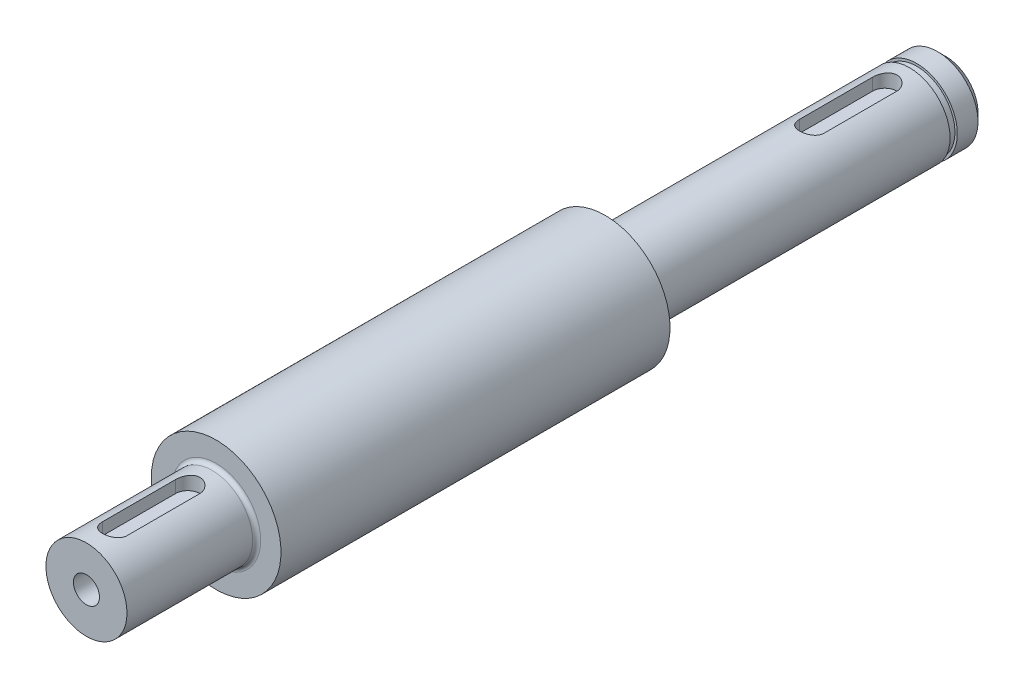
ISO-10303-21;
HEADER;
FILE_DESCRIPTION(('STEP AP214'),'2;1');
FILE_NAME('part.step','',(''),(''),'','','');
FILE_SCHEMA(('AUTOMOTIVE_DESIGN { 1 0 10303 214 1 1 1 1 }'));
ENDSEC;
DATA;
#1=APPLICATION_CONTEXT('core data for automotive mechanical design processes');
#2=APPLICATION_PROTOCOL_DEFINITION('international standard','automotive_design',2000,#1);
#3=PRODUCT_CONTEXT('',#1,'mechanical');
#4=PRODUCT('Part','Part','',(#3));
#5=PRODUCT_RELATED_PRODUCT_CATEGORY('part','',(#4));
#6=PRODUCT_DEFINITION_FORMATION('','',#4);
#7=PRODUCT_DEFINITION_CONTEXT('part definition',#1,'design');
#8=PRODUCT_DEFINITION('design','',#6,#7);
#9=PRODUCT_DEFINITION_SHAPE('','',#8);
#10=(LENGTH_UNIT() NAMED_UNIT(*) SI_UNIT(.MILLI.,.METRE.));
#11=(NAMED_UNIT(*) PLANE_ANGLE_UNIT() SI_UNIT($,.RADIAN.));
#12=(NAMED_UNIT(*) SI_UNIT($,.STERADIAN.) SOLID_ANGLE_UNIT());
#13=UNCERTAINTY_MEASURE_WITH_UNIT(LENGTH_MEASURE(1.E-05),#10,'distance_accuracy_value','');
#14=(GEOMETRIC_REPRESENTATION_CONTEXT(3) GLOBAL_UNCERTAINTY_ASSIGNED_CONTEXT((#13)) GLOBAL_UNIT_ASSIGNED_CONTEXT((#10,
#11,#12)) REPRESENTATION_CONTEXT('',''));
#15=CARTESIAN_POINT('',(0.,0.,0.));
#16=DIRECTION('',(0.,0.,1.));
#17=DIRECTION('',(1.,0.,0.));
#18=AXIS2_PLACEMENT_3D('',#15,#16,#17);
#19=CARTESIAN_POINT('',(0.,0.,-104.775));
#20=DIRECTION('',(0.,0.,1.));
#21=DIRECTION('',(1.,0.,0.));
#22=AXIS2_PLACEMENT_3D('',#19,#20,#21);
#23=CYLINDRICAL_SURFACE('',#22,7.9375);
#24=CARTESIAN_POINT('',(0.,0.,-97.7138));
#25=DIRECTION('',(0.,0.,-1.));
#26=DIRECTION('',(-1.,0.,0.));
#27=AXIS2_PLACEMENT_3D('',#24,#25,#26);
#28=CIRCLE('',#27,7.9375);
#29=CARTESIAN_POINT('',(-7.9375,0.,-97.7138));
#30=VERTEX_POINT('',#29);
#31=EDGE_CURVE('E328',#30,#30,#28,.T.);
#32=ORIENTED_EDGE('',*,*,#31,.F.);
#33=EDGE_LOOP('',(#32));
#34=FACE_BOUND('',#33,.T.);
#35=CARTESIAN_POINT('',(0.,0.,-38.89375));
#36=DIRECTION('',(0.,0.,1.));
#37=DIRECTION('',(1.,0.,0.));
#38=AXIS2_PLACEMENT_3D('',#35,#36,#37);
#39=CIRCLE('',#38,7.9375);
#40=CARTESIAN_POINT('',(7.9375,0.,-38.89375));
#41=VERTEX_POINT('',#40);
#42=EDGE_CURVE('E338',#41,#41,#39,.F.);
#43=ORIENTED_EDGE('',*,*,#42,.T.);
#44=EDGE_LOOP('',(#43));
#45=FACE_BOUND('',#44,.T.);
#46=CARTESIAN_POINT('',(2.38125,7.57189241124701,-78.58125));
#47=CARTESIAN_POINT('',(2.38125815852546,7.57188330559514,-78.515896180347));
#48=CARTESIAN_POINT('',(2.37855968505799,7.572738315761,-78.4505475887936));
#49=CARTESIAN_POINT('',(2.36781294676356,7.57610889609126,-78.3203491749924));
#50=CARTESIAN_POINT('',(2.3597658847055,7.57862409291874,-78.2554992439238));
#51=CARTESIAN_POINT('',(2.33841242871129,7.58523905503609,-78.1269194731844));
#52=CARTESIAN_POINT('',(2.32511938897703,7.58933479629779,-78.0631872152909));
#53=CARTESIAN_POINT('',(2.29340452092875,7.59897853654373,-77.9371410487185));
#54=CARTESIAN_POINT('',(2.27498255848908,7.60452657350651,-77.8748271771778));
#55=CARTESIAN_POINT('',(2.21224938904031,7.62310862387971,-77.6907026732828));
#56=CARTESIAN_POINT('',(2.16044345455984,7.63808962465373,-77.5715456766763));
#57=CARTESIAN_POINT('',(2.0384694080295,7.67153988586956,-77.3436143275917));
#58=CARTESIAN_POINT('',(1.96829275127301,7.69001076843196,-77.2348448388325));
#59=CARTESIAN_POINT('',(1.80919341959838,7.72901085096579,-77.0273073783164));
#60=CARTESIAN_POINT('',(1.719793635801,7.74958369966712,-76.9289126312142));
#61=CARTESIAN_POINT('',(1.52580765569405,7.79009767602093,-76.7482640682218));
#62=CARTESIAN_POINT('',(1.42121889879479,7.81003869646657,-76.6660129793728));
#63=CARTESIAN_POINT('',(1.19714960488396,7.84754016893874,-76.5183518008312));
#64=CARTESIAN_POINT('',(1.07740582874555,7.86504286102834,-76.4533251697976));
#65=CARTESIAN_POINT('',(0.828073603948397,7.89518471194964,-76.3444807530727));
#66=CARTESIAN_POINT('',(0.698487703771086,7.9078251246947,-76.3006574985767));
#67=CARTESIAN_POINT('',(0.437077965076354,7.92650878316165,-76.2367033557659));
#68=CARTESIAN_POINT('',(0.305424088331612,7.93273034455641,-76.2159307978329));
#69=CARTESIAN_POINT('',(0.0403599186203377,7.93850333232182,-76.1966387107279));
#70=CARTESIAN_POINT('',(-0.0930500370432356,7.93805602147906,-76.1981149686242));
#71=CARTESIAN_POINT('',(-0.353332414422008,7.93066744068434,-76.2228487451738));
#72=CARTESIAN_POINT('',(-0.480277718293151,7.92393347119356,-76.245410985829));
#73=CARTESIAN_POINT('',(-0.728487957843933,7.90498028000196,-76.3105402202653));
#74=CARTESIAN_POINT('',(-0.849752595567598,7.89276077093468,-76.3531082620794));
#75=CARTESIAN_POINT('',(-1.08481465769292,7.86392278694852,-76.4575119020478));
#76=CARTESIAN_POINT('',(-1.19850853458542,7.84725468411776,-76.5195663604661));
#77=CARTESIAN_POINT('',(-1.41409027820904,7.8112877913477,-76.6610077616523));
#78=CARTESIAN_POINT('',(-1.5159754916908,7.79198841230746,-76.7403985881592));
#79=CARTESIAN_POINT('',(-1.70918902734,7.75194781794582,-76.9178547810966));
#80=CARTESIAN_POINT('',(-1.79996070471305,7.73117969651158,-77.016520883724));
#81=CARTESIAN_POINT('',(-1.96384496569396,7.69118691494528,-77.2279021596881));
#82=CARTESIAN_POINT('',(-2.0369523969578,7.67196270623387,-77.3406214175793));
#83=CARTESIAN_POINT('',(-2.1640229649485,7.63710100713097,-77.5783959739143));
#84=CARTESIAN_POINT('',(-2.21778522566545,7.62150171540442,-77.7035643976048));
#85=CARTESIAN_POINT('',(-2.30323844032464,7.59611866049457,-77.9616876500708));
#86=CARTESIAN_POINT('',(-2.33496315483631,7.58632600517951,-78.094630228884));
#87=CARTESIAN_POINT('',(-2.3638066069925,7.57736026315947,-78.287554386399));
#88=CARTESIAN_POINT('',(-2.3703470974505,7.57531435586986,-78.3461265405101));
#89=CARTESIAN_POINT('',(-2.3790648953858,7.57258024171204,-78.4635392230705));
#90=CARTESIAN_POINT('',(-2.38124861837126,7.57189003854047,-78.5223792288414));
#91=CARTESIAN_POINT('',(-2.38124999999999,7.57189241124701,-78.58125));
#92=B_SPLINE_CURVE_WITH_KNOTS('',3,(#46,#47,#48,#49,#50,#51,#52,#53,#54,#55,#56,#57,#58,#59,#60,
#61,#62,#63,#64,#65,#66,#67,#68,#69,#70,#71,#72,#73,#74,#75,#76,#77,#78,#79,#80,#81,#82,#83,#84,
#85,#86,#87,#88,#89,#90,#91),.UNSPECIFIED.,.F.,.F.,(4,2,2,2,2,2,2,2,2,2,2,2,2,2,2,2,2,2,2,2,2,2,
4),(0.,0.195991275561324,0.391938492304214,0.587390088888293,0.782846797176359,1.17326844500357,
1.56387201187681,1.96560376359321,2.36740331889733,2.77751230929681,3.18751546734639,
3.58579420686406,3.98399753113254,4.36951721861804,4.75505710436409,5.14509213034555,
5.53521462280465,5.94033955159903,6.34558250580854,6.75491961154767,7.16362823927547,
7.3403957500019,7.51690277106334),.UNSPECIFIED.);
#93=CARTESIAN_POINT('',(2.38124999999999,7.57189241124701,-78.58125));
#94=VERTEX_POINT('',#93);
#95=CARTESIAN_POINT('',(-2.38124999999999,7.57189241124701,-78.58125));
#96=VERTEX_POINT('',#95);
#97=EDGE_CURVE('E260',#94,#96,#92,.T.);
#98=ORIENTED_EDGE('',*,*,#97,.T.);
#99=DIRECTION('',(0.,0.,1.));
#100=VECTOR('',#99,1.);
#101=CARTESIAN_POINT('',(-2.38125,7.57189241124701,-104.775));
#102=LINE('',#101,#100);
#103=CARTESIAN_POINT('',(-2.38125,7.57189241124701,-92.86875));
#104=VERTEX_POINT('',#103);
#105=EDGE_CURVE('E460',#96,#104,#102,.F.);
#106=ORIENTED_EDGE('',*,*,#105,.T.);
#107=CARTESIAN_POINT('',(-2.38125,7.57189241124701,-92.86875));
#108=CARTESIAN_POINT('',(-2.38125815852546,7.57188330559514,-92.934103819653));
#109=CARTESIAN_POINT('',(-2.37855968505799,7.572738315761,-92.9994524112064));
#110=CARTESIAN_POINT('',(-2.36781294676356,7.57610889609126,-93.1296508250076));
#111=CARTESIAN_POINT('',(-2.3597658847055,7.57862409291874,-93.1945007560762));
#112=CARTESIAN_POINT('',(-2.33841242871129,7.58523905503609,-93.3230805268156));
#113=CARTESIAN_POINT('',(-2.32511938897704,7.58933479629778,-93.3868127847092));
#114=CARTESIAN_POINT('',(-2.29340452092876,7.59897853654373,-93.5128589512815));
#115=CARTESIAN_POINT('',(-2.27498255848908,7.60452657350651,-93.5751728228222));
#116=CARTESIAN_POINT('',(-2.21224938904031,7.62310862387971,-93.7592973267172));
#117=CARTESIAN_POINT('',(-2.16044345455984,7.63808962465373,-93.8784543233237));
#118=CARTESIAN_POINT('',(-2.0384694080295,7.67153988586956,-94.1063856724084));
#119=CARTESIAN_POINT('',(-1.96829275127301,7.69001076843196,-94.2151551611675));
#120=CARTESIAN_POINT('',(-1.80919341959838,7.72901085096579,-94.4226926216836));
#121=CARTESIAN_POINT('',(-1.719793635801,7.74958369966712,-94.5210873687859));
#122=CARTESIAN_POINT('',(-1.52580765569405,7.79009767602093,-94.7017359317783));
#123=CARTESIAN_POINT('',(-1.42121889879479,7.81003869646657,-94.7839870206272));
#124=CARTESIAN_POINT('',(-1.19714960488396,7.84754016893874,-94.9316481991688));
#125=CARTESIAN_POINT('',(-1.07740582874555,7.86504286102834,-94.9966748302025));
#126=CARTESIAN_POINT('',(-0.828073603948397,7.89518471194964,-95.1055192469273));
#127=CARTESIAN_POINT('',(-0.698487703771086,7.9078251246947,-95.1493425014233));
#128=CARTESIAN_POINT('',(-0.437077965076354,7.92650878316165,-95.2132966442341));
#129=CARTESIAN_POINT('',(-0.305424088331612,7.93273034455641,-95.2340692021671));
#130=CARTESIAN_POINT('',(-0.0403599186203377,7.93850333232182,-95.2533612892722));
#131=CARTESIAN_POINT('',(0.0930500370432356,7.93805602147906,-95.2518850313758));
#132=CARTESIAN_POINT('',(0.353332414422008,7.93066744068434,-95.2271512548262));
#133=CARTESIAN_POINT('',(0.480277718293151,7.92393347119356,-95.2045890141711));
#134=CARTESIAN_POINT('',(0.728487957843933,7.90498028000196,-95.1394597797348));
#135=CARTESIAN_POINT('',(0.849752595567598,7.89276077093468,-95.0968917379206));
#136=CARTESIAN_POINT('',(1.08481465769292,7.86392278694852,-94.9924880979522));
#137=CARTESIAN_POINT('',(1.19850853458542,7.84725468411776,-94.930433639534));
#138=CARTESIAN_POINT('',(1.41409027820904,7.8112877913477,-94.7889922383477));
#139=CARTESIAN_POINT('',(1.5159754916908,7.79198841230746,-94.7096014118408));
#140=CARTESIAN_POINT('',(1.70918902734,7.75194781794582,-94.5321452189034));
#141=CARTESIAN_POINT('',(1.79996070471305,7.73117969651158,-94.4334791162761));
#142=CARTESIAN_POINT('',(1.96384496569396,7.69118691494528,-94.2220978403119));
#143=CARTESIAN_POINT('',(2.0369523969578,7.67196270623387,-94.1093785824207));
#144=CARTESIAN_POINT('',(2.1640229649485,7.63710100713097,-93.8716040260857));
#145=CARTESIAN_POINT('',(2.21778522566545,7.62150171540442,-93.7464356023952));
#146=CARTESIAN_POINT('',(2.30323844032464,7.59611866049457,-93.4883123499293));
#147=CARTESIAN_POINT('',(2.33496315483631,7.58632600517951,-93.355369771116));
#148=CARTESIAN_POINT('',(2.3638066069925,7.57736026315947,-93.1624456136011));
#149=CARTESIAN_POINT('',(2.3703470974505,7.57531435586986,-93.1038734594899));
#150=CARTESIAN_POINT('',(2.3790648953858,7.57258024171204,-92.9864607769295));
#151=CARTESIAN_POINT('',(2.38124861837126,7.57189003854047,-92.9276207711587));
#152=CARTESIAN_POINT('',(2.38124999999999,7.57189241124701,-92.86875));
#153=B_SPLINE_CURVE_WITH_KNOTS('',3,(#107,#108,#109,#110,#111,#112,#113,#114,#115,#116,#117,
#118,#119,#120,#121,#122,#123,#124,#125,#126,#127,#128,#129,#130,#131,#132,#133,#134,#135,#136,
#137,#138,#139,#140,#141,#142,#143,#144,#145,#146,#147,#148,#149,#150,#151,#152),.UNSPECIFIED.,
.F.,.F.,(4,2,2,2,2,2,2,2,2,2,2,2,2,2,2,2,2,2,2,2,2,2,4),(0.,0.195991275561324,0.391938492304214,
0.587390088888236,0.782846797176359,1.17326844500357,1.56387201187681,1.96560376359321,
2.36740331889733,2.77751230929681,3.18751546734639,3.58579420686406,3.98399753113254,
4.36951721861804,4.75505710436409,5.14509213034555,5.53521462280465,5.94033955159903,
6.34558250580854,6.75491961154767,7.16362823927547,7.3403957500019,7.51690277106334),.UNSPECIFIED.);
#154=CARTESIAN_POINT('',(2.38124999999999,7.57189241124701,-92.86875));
#155=VERTEX_POINT('',#154);
#156=EDGE_CURVE('E462',#104,#155,#153,.T.);
#157=ORIENTED_EDGE('',*,*,#156,.T.);
#158=DIRECTION('',(0.,0.,1.));
#159=VECTOR('',#158,1.);
#160=CARTESIAN_POINT('',(2.38124999999999,7.57189241124701,-104.775));
#161=LINE('',#160,#159);
#162=EDGE_CURVE('E461',#155,#94,#161,.T.);
#163=ORIENTED_EDGE('',*,*,#162,.T.);
#164=EDGE_LOOP('',(#98,#106,#157,#163));
#165=FACE_BOUND('',#164,.T.);
#166=ADVANCED_FACE('F188',(#34,#45,#165),#23,.T.);
#167=CARTESIAN_POINT('',(0.,0.,38.1));
#168=DIRECTION('',(0.,0.,-1.));
#169=DIRECTION('',(-1.,0.,0.));
#170=AXIS2_PLACEMENT_3D('',#167,#168,#169);
#171=CYLINDRICAL_SURFACE('',#170,12.7);
#172=CARTESIAN_POINT('',(0.,0.,38.1));
#173=DIRECTION('',(0.,0.,1.));
#174=DIRECTION('',(1.,0.,0.));
#175=AXIS2_PLACEMENT_3D('',#172,#173,#174);
#176=CIRCLE('',#175,12.7);
#177=CARTESIAN_POINT('',(-12.7,0.,38.1));
#178=VERTEX_POINT('',#177);
#179=EDGE_CURVE('E320',#178,#178,#176,.T.);
#180=CARTESIAN_POINT('',(0.,0.,-38.1));
#181=DIRECTION('',(0.,0.,1.));
#182=DIRECTION('',(1.,0.,0.));
#183=AXIS2_PLACEMENT_3D('',#180,#181,#182);
#184=CIRCLE('',#183,12.7);
#185=CARTESIAN_POINT('',(-12.7,0.,-38.1));
#186=VERTEX_POINT('',#185);
#187=EDGE_CURVE('E325',#186,#186,#184,.T.);
#188=CARTESIAN_POINT('',(-12.7,0.,38.1));
#189=CARTESIAN_POINT('',(-12.7,0.,37.30625));
#190=CARTESIAN_POINT('',(-12.7,0.,36.5125));
#191=CARTESIAN_POINT('',(-12.7,0.,34.925));
#192=CARTESIAN_POINT('',(-12.7,0.,34.13125));
#193=CARTESIAN_POINT('',(-12.7,0.,32.54375));
#194=CARTESIAN_POINT('',(-12.7,0.,31.75));
#195=CARTESIAN_POINT('',(-12.7,0.,30.1625));
#196=CARTESIAN_POINT('',(-12.7,0.,29.36875));
#197=CARTESIAN_POINT('',(-12.7,0.,27.78125));
#198=CARTESIAN_POINT('',(-12.7,0.,26.9875));
#199=CARTESIAN_POINT('',(-12.7,0.,25.4));
#200=CARTESIAN_POINT('',(-12.7,0.,24.60625));
#201=CARTESIAN_POINT('',(-12.7,0.,23.01875));
#202=CARTESIAN_POINT('',(-12.7,0.,22.225));
#203=CARTESIAN_POINT('',(-12.7,0.,20.6375));
#204=CARTESIAN_POINT('',(-12.7,0.,19.84375));
#205=CARTESIAN_POINT('',(-12.7,0.,18.25625));
#206=CARTESIAN_POINT('',(-12.7,0.,17.4625));
#207=CARTESIAN_POINT('',(-12.7,0.,15.875));
#208=CARTESIAN_POINT('',(-12.7,0.,15.08125));
#209=CARTESIAN_POINT('',(-12.7,0.,13.49375));
#210=CARTESIAN_POINT('',(-12.7,0.,12.7));
#211=CARTESIAN_POINT('',(-12.7,0.,11.1125));
#212=CARTESIAN_POINT('',(-12.7,0.,10.31875));
#213=CARTESIAN_POINT('',(-12.7,0.,8.73124999999999));
#214=CARTESIAN_POINT('',(-12.7,0.,7.93749999999999));
#215=CARTESIAN_POINT('',(-12.7,0.,6.34999999999999));
#216=CARTESIAN_POINT('',(-12.7,0.,5.55625));
#217=CARTESIAN_POINT('',(-12.7,0.,3.96875));
#218=CARTESIAN_POINT('',(-12.7,0.,3.17499999999999));
#219=CARTESIAN_POINT('',(-12.7,0.,1.58749999999999));
#220=CARTESIAN_POINT('',(-12.7,0.,0.793749999999994));
#221=CARTESIAN_POINT('',(-12.7,0.,-0.793750000000007));
#222=CARTESIAN_POINT('',(-12.7,0.,-1.58750000000001));
#223=CARTESIAN_POINT('',(-12.7,0.,-3.17500000000001));
#224=CARTESIAN_POINT('',(-12.7,0.,-3.96875000000001));
#225=CARTESIAN_POINT('',(-12.7,0.,-5.55625000000001));
#226=CARTESIAN_POINT('',(-12.7,0.,-6.35000000000001));
#227=CARTESIAN_POINT('',(-12.7,0.,-7.93750000000001));
#228=CARTESIAN_POINT('',(-12.7,0.,-8.73125000000001));
#229=CARTESIAN_POINT('',(-12.7,0.,-10.31875));
#230=CARTESIAN_POINT('',(-12.7,0.,-11.1125));
#231=CARTESIAN_POINT('',(-12.7,0.,-12.7));
#232=CARTESIAN_POINT('',(-12.7,0.,-13.49375));
#233=CARTESIAN_POINT('',(-12.7,0.,-15.08125));
#234=CARTESIAN_POINT('',(-12.7,0.,-15.875));
#235=CARTESIAN_POINT('',(-12.7,0.,-17.4625));
#236=CARTESIAN_POINT('',(-12.7,0.,-18.25625));
#237=CARTESIAN_POINT('',(-12.7,0.,-19.84375));
#238=CARTESIAN_POINT('',(-12.7,0.,-20.6375));
#239=CARTESIAN_POINT('',(-12.7,0.,-22.225));
#240=CARTESIAN_POINT('',(-12.7,0.,-23.01875));
#241=CARTESIAN_POINT('',(-12.7,0.,-24.60625));
#242=CARTESIAN_POINT('',(-12.7,0.,-25.4));
#243=CARTESIAN_POINT('',(-12.7,0.,-26.9875));
#244=CARTESIAN_POINT('',(-12.7,0.,-27.78125));
#245=CARTESIAN_POINT('',(-12.7,0.,-29.36875));
#246=CARTESIAN_POINT('',(-12.7,0.,-30.1625));
#247=CARTESIAN_POINT('',(-12.7,0.,-31.75));
#248=CARTESIAN_POINT('',(-12.7,0.,-32.54375));
#249=CARTESIAN_POINT('',(-12.7,0.,-34.13125));
#250=CARTESIAN_POINT('',(-12.7,0.,-34.925));
#251=CARTESIAN_POINT('',(-12.7,0.,-36.5125));
#252=CARTESIAN_POINT('',(-12.7,0.,-37.30625));
#253=CARTESIAN_POINT('',(-12.7,0.,-38.1));
#254=B_SPLINE_CURVE_WITH_KNOTS('',3,(#188,#189,#190,#191,#192,#193,#194,#195,#196,#197,#198,
#199,#200,#201,#202,#203,#204,#205,#206,#207,#208,#209,#210,#211,#212,#213,#214,#215,#216,#217,
#218,#219,#220,#221,#222,#223,#224,#225,#226,#227,#228,#229,#230,#231,#232,#233,#234,#235,#236,
#237,#238,#239,#240,#241,#242,#243,#244,#245,#246,#247,#248,#249,#250,#251,#252,#253),
.UNSPECIFIED.,.F.,.F.,(4,2,2,2,2,2,2,2,2,2,2,2,2,2,2,2,2,2,2,2,2,2,2,2,2,2,2,2,2,2,2,2,4),(0.,
2.38124999999999,4.7625,7.14375,9.525,11.90625,14.2875,16.66875,19.05,21.43125,23.8125,26.19375,
28.575,30.95625,33.3375,35.71875,38.1,40.48125,42.8625,45.24375,47.625,50.00625,52.3875,
54.76875,57.15,59.53125,61.9125,64.29375,66.675,69.05625,71.4375,73.81875,76.2),.UNSPECIFIED.);
#255=EDGE_CURVE('BSEAM396',#178,#186,#254,.T.);
#256=ORIENTED_EDGE('',*,*,#179,.F.);
#257=ORIENTED_EDGE('',*,*,#187,.T.);
#258=ORIENTED_EDGE('',*,*,#255,.T.);
#259=ORIENTED_EDGE('',*,*,#255,.F.);
#260=EDGE_LOOP('',(#256,#258,#257,#259));
#261=FACE_BOUND('',#260,.T.);
#262=ADVANCED_FACE('F396',(#261),#171,.T.);
#263=CARTESIAN_POINT('',(0.,0.,38.1));
#264=DIRECTION('',(0.,0.,1.));
#265=DIRECTION('',(1.,0.,0.));
#266=AXIS2_PLACEMENT_3D('',#263,#264,#265);
#267=PLANE('',#266);
#268=CARTESIAN_POINT('',(0.,0.,38.1));
#269=DIRECTION('',(0.,0.,1.));
#270=DIRECTION('',(1.,0.,0.));
#271=AXIS2_PLACEMENT_3D('',#268,#269,#270);
#272=CIRCLE('',#271,8.73125);
#273=CARTESIAN_POINT('',(8.73125,0.,38.1));
#274=VERTEX_POINT('',#273);
#275=EDGE_CURVE('E335',#274,#274,#272,.F.);
#276=ORIENTED_EDGE('',*,*,#275,.T.);
#277=EDGE_LOOP('',(#276));
#278=FACE_BOUND('',#277,.T.);
#279=ORIENTED_EDGE('',*,*,#179,.T.);
#280=EDGE_LOOP('',(#279));
#281=FACE_BOUND('',#280,.T.);
#282=ADVANCED_FACE('F402',(#278,#281),#267,.T.);
#283=CARTESIAN_POINT('',(0.,0.,-38.1));
#284=DIRECTION('',(0.,0.,1.));
#285=DIRECTION('',(1.,0.,0.));
#286=AXIS2_PLACEMENT_3D('',#283,#284,#285);
#287=PLANE('',#286);
#288=CARTESIAN_POINT('',(0.,0.,-38.1));
#289=DIRECTION('',(0.,0.,1.));
#290=DIRECTION('',(1.,0.,0.));
#291=AXIS2_PLACEMENT_3D('',#288,#289,#290);
#292=CIRCLE('',#291,8.73125);
#293=CARTESIAN_POINT('',(8.73125,0.,-38.1));
#294=VERTEX_POINT('',#293);
#295=EDGE_CURVE('E341',#294,#294,#292,.T.);
#296=ORIENTED_EDGE('',*,*,#295,.T.);
#297=EDGE_LOOP('',(#296));
#298=FACE_BOUND('',#297,.T.);
#299=ORIENTED_EDGE('',*,*,#187,.F.);
#300=EDGE_LOOP('',(#299));
#301=FACE_BOUND('',#300,.T.);
#302=ADVANCED_FACE('F432',(#298,#301),#287,.F.);
#303=CARTESIAN_POINT('',(0.,0.,-97.7138));
#304=DIRECTION('',(0.,0.,-1.));
#305=DIRECTION('',(-1.,0.,0.));
#306=AXIS2_PLACEMENT_3D('',#303,#304,#305);
#307=PLANE('',#306);
#308=CARTESIAN_POINT('',(0.,0.,-97.7138));
#309=DIRECTION('',(0.,0.,-1.));
#310=DIRECTION('',(-1.,0.,0.));
#311=AXIS2_PLACEMENT_3D('',#308,#309,#310);
#312=CIRCLE('',#311,7.4676);
#313=CARTESIAN_POINT('',(-7.4676,0.,-97.7138));
#314=VERTEX_POINT('',#313);
#315=EDGE_CURVE('E314',#314,#314,#312,.T.);
#316=ORIENTED_EDGE('',*,*,#315,.F.);
#317=EDGE_LOOP('',(#316));
#318=FACE_BOUND('',#317,.T.);
#319=ORIENTED_EDGE('',*,*,#31,.T.);
#320=EDGE_LOOP('',(#319));
#321=FACE_BOUND('',#320,.T.);
#322=ADVANCED_FACE('F424',(#318,#321),#307,.T.);
#323=CARTESIAN_POINT('',(0.,0.,-99.1362));
#324=DIRECTION('',(0.,0.,-1.));
#325=DIRECTION('',(-1.,0.,0.));
#326=AXIS2_PLACEMENT_3D('',#323,#324,#325);
#327=PLANE('',#326);
#328=CARTESIAN_POINT('',(0.,0.,-99.1362));
#329=DIRECTION('',(0.,0.,-1.));
#330=DIRECTION('',(-1.,0.,0.));
#331=AXIS2_PLACEMENT_3D('',#328,#329,#330);
#332=CIRCLE('',#331,7.4676);
#333=CARTESIAN_POINT('',(-7.4676,0.,-99.1362));
#334=VERTEX_POINT('',#333);
#335=EDGE_CURVE('E313',#334,#334,#332,.T.);
#336=ORIENTED_EDGE('',*,*,#335,.T.);
#337=EDGE_LOOP('',(#336));
#338=FACE_BOUND('',#337,.T.);
#339=CARTESIAN_POINT('',(0.,0.,-99.1362));
#340=DIRECTION('',(0.,0.,-1.));
#341=DIRECTION('',(-1.,0.,0.));
#342=AXIS2_PLACEMENT_3D('',#339,#340,#341);
#343=CIRCLE('',#342,7.9375);
#344=CARTESIAN_POINT('',(-7.9375,0.,-99.1362));
#345=VERTEX_POINT('',#344);
#346=EDGE_CURVE('E317',#345,#345,#343,.T.);
#347=ORIENTED_EDGE('',*,*,#346,.F.);
#348=EDGE_LOOP('',(#347));
#349=FACE_BOUND('',#348,.T.);
#350=ADVANCED_FACE('F422',(#338,#349),#327,.F.);
#351=CARTESIAN_POINT('',(0.,0.,-97.7138));
#352=DIRECTION('',(0.,0.,-1.));
#353=DIRECTION('',(-1.,0.,0.));
#354=AXIS2_PLACEMENT_3D('',#351,#352,#353);
#355=CYLINDRICAL_SURFACE('',#354,7.4676);
#356=ORIENTED_EDGE('',*,*,#315,.T.);
#357=EDGE_LOOP('',(#356));
#358=FACE_BOUND('',#357,.T.);
#359=ORIENTED_EDGE('',*,*,#335,.F.);
#360=EDGE_LOOP('',(#359));
#361=FACE_BOUND('',#360,.T.);
#362=ADVANCED_FACE('F416',(#358,#361),#355,.T.);
#363=CARTESIAN_POINT('',(0.,0.,-104.775));
#364=DIRECTION('',(0.,0.,-1.));
#365=DIRECTION('',(-1.,0.,0.));
#366=AXIS2_PLACEMENT_3D('',#363,#364,#365);
#367=PLANE('',#366);
#368=CARTESIAN_POINT('',(0.,0.,-104.775));
#369=DIRECTION('',(0.,0.,-1.));
#370=DIRECTION('',(-1.,0.,0.));
#371=AXIS2_PLACEMENT_3D('',#368,#369,#370);
#372=CIRCLE('',#371,6.34999999999997);
#373=CARTESIAN_POINT('',(-6.34999999999997,0.,-104.775));
#374=VERTEX_POINT('',#373);
#375=EDGE_CURVE('E196',#374,#374,#372,.T.);
#376=ORIENTED_EDGE('',*,*,#375,.T.);
#377=EDGE_LOOP('',(#376));
#378=FACE_BOUND('',#377,.T.);
#379=ADVANCED_FACE('F411',(#378),#367,.T.);
#380=CARTESIAN_POINT('',(0.,0.,-103.1875));
#381=DIRECTION('',(0.,0.,-1.));
#382=DIRECTION('',(-1.,0.,0.));
#383=AXIS2_PLACEMENT_3D('',#380,#381,#382);
#384=CIRCLE('',#383,7.9375);
#385=CARTESIAN_POINT('',(-7.9375,0.,-103.1875));
#386=VERTEX_POINT('',#385);
#387=EDGE_CURVE('E13',#386,#386,#384,.F.);
#388=ORIENTED_EDGE('',*,*,#387,.T.);
#389=EDGE_LOOP('',(#388));
#390=FACE_BOUND('',#389,.T.);
#391=ORIENTED_EDGE('',*,*,#346,.T.);
#392=EDGE_LOOP('',(#391));
#393=FACE_BOUND('',#392,.T.);
#394=ADVANCED_FACE('F391',(#390,#393),#23,.T.);
#395=CARTESIAN_POINT('',(0.,0.,63.5));
#396=DIRECTION('',(0.,0.,-1.));
#397=DIRECTION('',(-1.,0.,0.));
#398=AXIS2_PLACEMENT_3D('',#395,#396,#397);
#399=CYLINDRICAL_SURFACE('',#398,7.9375);
#400=DIRECTION('',(0.,0.,-1.));
#401=VECTOR('',#400,1.);
#402=CARTESIAN_POINT('',(2.38124999999999,7.57189241124701,63.5));
#403=LINE('',#402,#401);
#404=CARTESIAN_POINT('',(2.38124999999999,7.57189241124701,43.65625));
#405=VERTEX_POINT('',#404);
#406=CARTESIAN_POINT('',(2.38124999999999,7.57189241124701,57.94375));
#407=VERTEX_POINT('',#406);
#408=EDGE_CURVE('E353',#405,#407,#403,.F.);
#409=ORIENTED_EDGE('',*,*,#408,.T.);
#410=CARTESIAN_POINT('',(2.38125,7.57189241124701,57.94375));
#411=CARTESIAN_POINT('',(2.38125815852546,7.57188330559514,58.009103819653));
#412=CARTESIAN_POINT('',(2.37855968505799,7.572738315761,58.0744524112064));
#413=CARTESIAN_POINT('',(2.36781294676356,7.57610889609126,58.2046508250076));
#414=CARTESIAN_POINT('',(2.35976588470551,7.57862409291874,58.2695007560762));
#415=CARTESIAN_POINT('',(2.33841242871129,7.58523905503609,58.3980805268156));
#416=CARTESIAN_POINT('',(2.32511938897704,7.58933479629778,58.4618127847091));
#417=CARTESIAN_POINT('',(2.29340452092875,7.59897853654373,58.5878589512815));
#418=CARTESIAN_POINT('',(2.27498255848908,7.60452657350651,58.6501728228222));
#419=CARTESIAN_POINT('',(2.21224938904031,7.62310862387971,58.8342973267172));
#420=CARTESIAN_POINT('',(2.16044345455984,7.63808962465373,58.9534543233237));
#421=CARTESIAN_POINT('',(2.0384694080295,7.67153988586956,59.1813856724083));
#422=CARTESIAN_POINT('',(1.96829275127302,7.69001076843196,59.2901551611675));
#423=CARTESIAN_POINT('',(1.80919341959839,7.72901085096578,59.4976926216836));
#424=CARTESIAN_POINT('',(1.71979363580101,7.74958369966712,59.5960873687858));
#425=CARTESIAN_POINT('',(1.52580765569406,7.79009767602092,59.7767359317782));
#426=CARTESIAN_POINT('',(1.4212188987948,7.81003869646656,59.8589870206272));
#427=CARTESIAN_POINT('',(1.19714960488397,7.84754016893874,60.0066481991688));
#428=CARTESIAN_POINT('',(1.07740582874556,7.86504286102834,60.0716748302024));
#429=CARTESIAN_POINT('',(0.828073603948407,7.89518471194964,60.1805192469273));
#430=CARTESIAN_POINT('',(0.698487703771092,7.9078251246947,60.2243425014233));
#431=CARTESIAN_POINT('',(0.437077965076358,7.92650878316166,60.2882966442341));
#432=CARTESIAN_POINT('',(0.305424088331617,7.93273034455641,60.3090692021671));
#433=CARTESIAN_POINT('',(0.0403599186203422,7.93850333232182,60.3283612892722));
#434=CARTESIAN_POINT('',(-0.0930500370432323,7.93805602147906,60.3268850313758));
#435=CARTESIAN_POINT('',(-0.353332414422005,7.93066744068434,60.3021512548261));
#436=CARTESIAN_POINT('',(-0.480277718293146,7.92393347119356,60.279589014171));
#437=CARTESIAN_POINT('',(-0.728487957843928,7.90498028000196,60.2144597797348));
#438=CARTESIAN_POINT('',(-0.849752595567593,7.89276077093468,60.1718917379206));
#439=CARTESIAN_POINT('',(-1.08481465769291,7.86392278694852,60.0674880979522));
#440=CARTESIAN_POINT('',(-1.19850853458541,7.84725468411776,60.005433639534));
#441=CARTESIAN_POINT('',(-1.41409027820904,7.8112877913477,59.8639922383477));
#442=CARTESIAN_POINT('',(-1.51597549169079,7.79198841230746,59.7846014118408));
#443=CARTESIAN_POINT('',(-1.70918902734,7.75194781794582,59.6071452189034));
#444=CARTESIAN_POINT('',(-1.79996070471305,7.73117969651158,59.508479116276));
#445=CARTESIAN_POINT('',(-1.96384496569396,7.69118691494528,59.2970978403119));
#446=CARTESIAN_POINT('',(-2.0369523969578,7.67196270623387,59.1843785824207));
#447=CARTESIAN_POINT('',(-2.16402296494849,7.63710100713097,58.9466040260857));
#448=CARTESIAN_POINT('',(-2.21778522566545,7.62150171540442,58.8214356023952));
#449=CARTESIAN_POINT('',(-2.30323844032464,7.59611866049457,58.5633123499292));
#450=CARTESIAN_POINT('',(-2.33496315483631,7.58632600517952,58.430369771116));
#451=CARTESIAN_POINT('',(-2.3638066069925,7.57736026315947,58.2374456136011));
#452=CARTESIAN_POINT('',(-2.3703470974505,7.57531435586986,58.1788734594899));
#453=CARTESIAN_POINT('',(-2.3790648953858,7.57258024171204,58.0614607769295));
#454=CARTESIAN_POINT('',(-2.38124861837126,7.57189003854047,58.0026207711586));
#455=CARTESIAN_POINT('',(-2.38124999999999,7.57189241124701,57.94375));
#456=B_SPLINE_CURVE_WITH_KNOTS('',3,(#410,#411,#412,#413,#414,#415,#416,#417,#418,#419,#420,
#421,#422,#423,#424,#425,#426,#427,#428,#429,#430,#431,#432,#433,#434,#435,#436,#437,#438,#439,
#440,#441,#442,#443,#444,#445,#446,#447,#448,#449,#450,#451,#452,#453,#454,#455),.UNSPECIFIED.,
.F.,.F.,(4,2,2,2,2,2,2,2,2,2,2,2,2,2,2,2,2,2,2,2,2,2,4),(0.,0.195991275561324,0.3919384923042,
0.587390088888257,0.782846797176352,1.17326844500356,1.5638720118768,1.9656037635932,
2.36740331889731,2.7775123092968,3.18751546734638,3.58579420686405,3.98399753113254,
4.36951721861803,4.75505710436408,5.14509213034553,5.53521462280464,5.94033955159902,
6.34558250580853,6.75491961154767,7.16362823927546,7.3403957500019,7.51690277106333),.UNSPECIFIED.);
#457=CARTESIAN_POINT('',(-2.38124999999999,7.57189241124701,57.94375));
#458=VERTEX_POINT('',#457);
#459=EDGE_CURVE('E508',#407,#458,#456,.T.);
#460=ORIENTED_EDGE('',*,*,#459,.T.);
#461=DIRECTION('',(0.,0.,-1.));
#462=VECTOR('',#461,1.);
#463=CARTESIAN_POINT('',(-2.38124999999999,7.57189241124701,63.5));
#464=LINE('',#463,#462);
#465=CARTESIAN_POINT('',(-2.38125,7.57189241124701,43.65625));
#466=VERTEX_POINT('',#465);
#467=EDGE_CURVE('E501',#458,#466,#464,.T.);
#468=ORIENTED_EDGE('',*,*,#467,.T.);
#469=CARTESIAN_POINT('',(-2.38125,7.57189241124701,43.65625));
#470=CARTESIAN_POINT('',(-2.38125815852546,7.57188330559514,43.590896180347));
#471=CARTESIAN_POINT('',(-2.37855968505799,7.572738315761,43.5255475887936));
#472=CARTESIAN_POINT('',(-2.36781294676356,7.57610889609126,43.3953491749924));
#473=CARTESIAN_POINT('',(-2.35976588470551,7.57862409291874,43.3304992439238));
#474=CARTESIAN_POINT('',(-2.33841242871129,7.58523905503609,43.2019194731844));
#475=CARTESIAN_POINT('',(-2.32511938897703,7.58933479629778,43.1381872152908));
#476=CARTESIAN_POINT('',(-2.29340452092875,7.59897853654373,43.0121410487185));
#477=CARTESIAN_POINT('',(-2.27498255848908,7.60452657350651,42.9498271771778));
#478=CARTESIAN_POINT('',(-2.21224938904031,7.62310862387971,42.7657026732828));
#479=CARTESIAN_POINT('',(-2.16044345455984,7.63808962465373,42.6465456766763));
#480=CARTESIAN_POINT('',(-2.0384694080295,7.67153988586956,42.4186143275916));
#481=CARTESIAN_POINT('',(-1.96829275127302,7.69001076843196,42.3098448388325));
#482=CARTESIAN_POINT('',(-1.80919341959839,7.72901085096578,42.1023073783164));
#483=CARTESIAN_POINT('',(-1.71979363580101,7.74958369966712,42.0039126312142));
#484=CARTESIAN_POINT('',(-1.52580765569406,7.79009767602092,41.8232640682217));
#485=CARTESIAN_POINT('',(-1.4212188987948,7.81003869646656,41.7410129793728));
#486=CARTESIAN_POINT('',(-1.19714960488397,7.84754016893874,41.5933518008312));
#487=CARTESIAN_POINT('',(-1.07740582874556,7.86504286102834,41.5283251697976));
#488=CARTESIAN_POINT('',(-0.828073603948407,7.89518471194964,41.4194807530727));
#489=CARTESIAN_POINT('',(-0.698487703771092,7.9078251246947,41.3756574985767));
#490=CARTESIAN_POINT('',(-0.437077965076358,7.92650878316166,41.3117033557659));
#491=CARTESIAN_POINT('',(-0.305424088331617,7.93273034455641,41.2909307978329));
#492=CARTESIAN_POINT('',(-0.0403599186203422,7.93850333232182,41.2716387107278));
#493=CARTESIAN_POINT('',(0.0930500370432323,7.93805602147906,41.2731149686242));
#494=CARTESIAN_POINT('',(0.353332414422005,7.93066744068434,41.2978487451738));
#495=CARTESIAN_POINT('',(0.480277718293148,7.92393347119356,41.320410985829));
#496=CARTESIAN_POINT('',(0.72848795784393,7.90498028000196,41.3855402202652));
#497=CARTESIAN_POINT('',(0.849752595567594,7.89276077093468,41.4281082620794));
#498=CARTESIAN_POINT('',(1.08481465769291,7.86392278694852,41.5325119020478));
#499=CARTESIAN_POINT('',(1.19850853458541,7.84725468411776,41.594566360466));
#500=CARTESIAN_POINT('',(1.41409027820903,7.8112877913477,41.7360077616523));
#501=CARTESIAN_POINT('',(1.51597549169079,7.79198841230746,41.8153985881592));
#502=CARTESIAN_POINT('',(1.70918902734,7.75194781794582,41.9928547810966));
#503=CARTESIAN_POINT('',(1.79996070471305,7.73117969651158,42.0915208837239));
#504=CARTESIAN_POINT('',(1.96384496569396,7.69118691494528,42.3029021596881));
#505=CARTESIAN_POINT('',(2.0369523969578,7.67196270623387,42.4156214175793));
#506=CARTESIAN_POINT('',(2.1640229649485,7.63710100713097,42.6533959739143));
#507=CARTESIAN_POINT('',(2.21778522566545,7.62150171540442,42.7785643976048));
#508=CARTESIAN_POINT('',(2.30323844032464,7.59611866049457,43.0366876500708));
#509=CARTESIAN_POINT('',(2.33496315483631,7.58632600517952,43.169630228884));
#510=CARTESIAN_POINT('',(2.3638066069925,7.57736026315947,43.3625543863989));
#511=CARTESIAN_POINT('',(2.3703470974505,7.57531435586986,43.4211265405101));
#512=CARTESIAN_POINT('',(2.3790648953858,7.57258024171204,43.5385392230705));
#513=CARTESIAN_POINT('',(2.38124861837126,7.57189003854047,43.5973792288414));
#514=CARTESIAN_POINT('',(2.38124999999999,7.57189241124701,43.65625));
#515=B_SPLINE_CURVE_WITH_KNOTS('',3,(#469,#470,#471,#472,#473,#474,#475,#476,#477,#478,#479,
#480,#481,#482,#483,#484,#485,#486,#487,#488,#489,#490,#491,#492,#493,#494,#495,#496,#497,#498,
#499,#500,#501,#502,#503,#504,#505,#506,#507,#508,#509,#510,#511,#512,#513,#514),.UNSPECIFIED.,
.F.,.F.,(4,2,2,2,2,2,2,2,2,2,2,2,2,2,2,2,2,2,2,2,2,2,4),(0.,0.195991275561324,0.3919384923042,
0.587390088888271,0.782846797176352,1.17326844500358,1.5638720118768,1.9656037635932,
2.36740331889731,2.7775123092968,3.18751546734638,3.58579420686405,3.98399753113254,
4.36951721861803,4.75505710436408,5.14509213034553,5.53521462280464,5.94033955159901,
6.34558250580853,6.75491961154768,7.16362823927547,7.3403957500019,7.51690277106333),.UNSPECIFIED.);
#516=EDGE_CURVE('E344',#466,#405,#515,.T.);
#517=ORIENTED_EDGE('',*,*,#516,.T.);
#518=EDGE_LOOP('',(#409,#460,#468,#517));
#519=FACE_BOUND('',#518,.T.);
#520=CARTESIAN_POINT('',(0.,0.,38.89375));
#521=DIRECTION('',(0.,0.,1.));
#522=DIRECTION('',(1.,0.,0.));
#523=AXIS2_PLACEMENT_3D('',#520,#521,#522);
#524=CIRCLE('',#523,7.9375);
#525=CARTESIAN_POINT('',(7.9375,0.,38.89375));
#526=VERTEX_POINT('',#525);
#527=EDGE_CURVE('E324',#526,#526,#524,.T.);
#528=ORIENTED_EDGE('',*,*,#527,.T.);
#529=EDGE_LOOP('',(#528));
#530=FACE_BOUND('',#529,.T.);
#531=CARTESIAN_POINT('',(0.,0.,63.5));
#532=DIRECTION('',(0.,0.,1.));
#533=DIRECTION('',(1.,0.,0.));
#534=AXIS2_PLACEMENT_3D('',#531,#532,#533);
#535=CIRCLE('',#534,7.9375);
#536=CARTESIAN_POINT('',(7.9375,0.,63.5));
#537=VERTEX_POINT('',#536);
#538=EDGE_CURVE('E310',#537,#537,#535,.T.);
#539=ORIENTED_EDGE('',*,*,#538,.F.);
#540=EDGE_LOOP('',(#539));
#541=FACE_BOUND('',#540,.T.);
#542=ADVANCED_FACE('F355',(#519,#530,#541),#399,.T.);
#543=CARTESIAN_POINT('',(0.,0.,63.5));
#544=DIRECTION('',(0.,0.,1.));
#545=DIRECTION('',(1.,0.,0.));
#546=AXIS2_PLACEMENT_3D('',#543,#544,#545);
#547=PLANE('',#546);
#548=CARTESIAN_POINT('',(0.,0.,63.5));
#549=DIRECTION('',(0.,0.,1.));
#550=DIRECTION('',(1.,0.,0.));
#551=AXIS2_PLACEMENT_3D('',#548,#549,#550);
#552=CIRCLE('',#551,2.5527);
#553=CARTESIAN_POINT('',(2.5527,0.,63.5));
#554=VERTEX_POINT('',#553);
#555=EDGE_CURVE('E304',#554,#554,#552,.T.);
#556=ORIENTED_EDGE('',*,*,#555,.F.);
#557=EDGE_LOOP('',(#556));
#558=FACE_BOUND('',#557,.T.);
#559=ORIENTED_EDGE('',*,*,#538,.T.);
#560=EDGE_LOOP('',(#559));
#561=FACE_BOUND('',#560,.T.);
#562=ADVANCED_FACE('F381',(#558,#561),#547,.T.);
#563=CARTESIAN_POINT('',(0.,0.,38.89375));
#564=DIRECTION('',(0.,0.,1.));
#565=DIRECTION('',(1.,0.,0.));
#566=AXIS2_PLACEMENT_3D('',#563,#564,#565);
#567=TOROIDAL_SURFACE('',#566,8.73125,0.79375);
#568=ORIENTED_EDGE('',*,*,#275,.F.);
#569=EDGE_LOOP('',(#568));
#570=FACE_BOUND('',#569,.T.);
#571=ORIENTED_EDGE('',*,*,#527,.F.);
#572=EDGE_LOOP('',(#571));
#573=FACE_BOUND('',#572,.T.);
#574=ADVANCED_FACE('F383',(#570,#573),#567,.F.);
#575=CARTESIAN_POINT('',(0.,0.,-38.89375));
#576=DIRECTION('',(0.,0.,1.));
#577=DIRECTION('',(1.,0.,0.));
#578=AXIS2_PLACEMENT_3D('',#575,#576,#577);
#579=TOROIDAL_SURFACE('',#578,8.73125,0.79375);
#580=ORIENTED_EDGE('',*,*,#295,.F.);
#581=EDGE_LOOP('',(#580));
#582=FACE_BOUND('',#581,.T.);
#583=ORIENTED_EDGE('',*,*,#42,.F.);
#584=EDGE_LOOP('',(#583));
#585=FACE_BOUND('',#584,.T.);
#586=ADVANCED_FACE('F379',(#582,#585),#579,.F.);
#587=CARTESIAN_POINT('',(0.,0.,25.4));
#588=DIRECTION('',(0.,0.,1.));
#589=DIRECTION('',(1.,0.,0.));
#590=AXIS2_PLACEMENT_3D('',#587,#588,#589);
#591=CONICAL_SURFACE('',#590,2.55269999999999,1.02974425867665);
#592=CARTESIAN_POINT('',(0.,0.,23.8661830978083));
#593=VERTEX_POINT('',#592);
#594=VERTEX_LOOP('',#593);
#595=FACE_BOUND('',#594,.T.);
#596=CARTESIAN_POINT('',(0.,0.,25.4));
#597=DIRECTION('',(0.,0.,1.));
#598=DIRECTION('',(1.,0.,0.));
#599=AXIS2_PLACEMENT_3D('',#596,#597,#598);
#600=CIRCLE('',#599,2.55269999999999);
#601=CARTESIAN_POINT('',(2.55269999999999,0.,25.4));
#602=VERTEX_POINT('',#601);
#603=EDGE_CURVE('E307',#602,#602,#600,.T.);
#604=ORIENTED_EDGE('',*,*,#603,.T.);
#605=EDGE_LOOP('',(#604));
#606=FACE_BOUND('',#605,.T.);
#607=ADVANCED_FACE('F376',(#595,#606),#591,.F.);
#608=CARTESIAN_POINT('',(0.,0.,63.5));
#609=DIRECTION('',(0.,0.,1.));
#610=DIRECTION('',(1.,0.,0.));
#611=AXIS2_PLACEMENT_3D('',#608,#609,#610);
#612=CYLINDRICAL_SURFACE('',#611,2.55269999999999);
#613=ORIENTED_EDGE('',*,*,#603,.F.);
#614=EDGE_LOOP('',(#613));
#615=FACE_BOUND('',#614,.T.);
#616=ORIENTED_EDGE('',*,*,#555,.T.);
#617=EDGE_LOOP('',(#616));
#618=FACE_BOUND('',#617,.T.);
#619=ADVANCED_FACE('F372',(#615,#618),#612,.F.);
#620=CARTESIAN_POINT('',(-2.38124999999999,7.9375,57.94375));
#621=DIRECTION('',(-1.,0.,0.));
#622=DIRECTION('',(0.,0.,1.));
#623=AXIS2_PLACEMENT_3D('',#620,#621,#622);
#624=PLANE('',#623);
#625=DIRECTION('',(0.,1.,0.));
#626=VECTOR('',#625,1.);
#627=CARTESIAN_POINT('',(-2.38124999999999,7.9375,57.94375));
#628=LINE('',#627,#626);
#629=CARTESIAN_POINT('',(-2.38125,5.19049,57.94375));
#630=VERTEX_POINT('',#629);
#631=EDGE_CURVE('E295',#458,#630,#628,.F.);
#632=ORIENTED_EDGE('',*,*,#631,.T.);
#633=DIRECTION('',(0.,0.,-1.));
#634=VECTOR('',#633,1.);
#635=CARTESIAN_POINT('',(-2.38124999999999,5.19049,57.94375));
#636=LINE('',#635,#634);
#637=CARTESIAN_POINT('',(-2.38125,5.19049,43.65625));
#638=VERTEX_POINT('',#637);
#639=EDGE_CURVE('E288',#630,#638,#636,.T.);
#640=ORIENTED_EDGE('',*,*,#639,.T.);
#641=DIRECTION('',(0.,1.,0.));
#642=VECTOR('',#641,1.);
#643=CARTESIAN_POINT('',(-2.38125,7.9375,43.65625));
#644=LINE('',#643,#642);
#645=EDGE_CURVE('E301',#638,#466,#644,.T.);
#646=ORIENTED_EDGE('',*,*,#645,.T.);
#647=ORIENTED_EDGE('',*,*,#467,.F.);
#648=EDGE_LOOP('',(#632,#640,#646,#647));
#649=FACE_BOUND('',#648,.T.);
#650=ADVANCED_FACE('F375',(#649),#624,.F.);
#651=CARTESIAN_POINT('',(2.38125,5.19049,57.94375));
#652=DIRECTION('',(1.,0.,0.));
#653=DIRECTION('',(0.,1.,0.));
#654=AXIS2_PLACEMENT_3D('',#651,#652,#653);
#655=PLANE('',#654);
#656=DIRECTION('',(0.,-1.,0.));
#657=VECTOR('',#656,1.);
#658=CARTESIAN_POINT('',(2.38125,5.19049,43.65625));
#659=LINE('',#658,#657);
#660=CARTESIAN_POINT('',(2.38125,5.19049,43.65625));
#661=VERTEX_POINT('',#660);
#662=EDGE_CURVE('E211',#405,#661,#659,.T.);
#663=ORIENTED_EDGE('',*,*,#662,.T.);
#664=DIRECTION('',(0.,0.,-1.));
#665=VECTOR('',#664,1.);
#666=CARTESIAN_POINT('',(2.38125,5.19049,57.94375));
#667=LINE('',#666,#665);
#668=CARTESIAN_POINT('',(2.38125,5.19049,57.94375));
#669=VERTEX_POINT('',#668);
#670=EDGE_CURVE('E285',#669,#661,#667,.T.);
#671=ORIENTED_EDGE('',*,*,#670,.F.);
#672=DIRECTION('',(0.,-1.,0.));
#673=VECTOR('',#672,1.);
#674=CARTESIAN_POINT('',(2.38125,5.19049,57.94375));
#675=LINE('',#674,#673);
#676=EDGE_CURVE('E290',#407,#669,#675,.T.);
#677=ORIENTED_EDGE('',*,*,#676,.F.);
#678=ORIENTED_EDGE('',*,*,#408,.F.);
#679=EDGE_LOOP('',(#663,#671,#677,#678));
#680=FACE_BOUND('',#679,.T.);
#681=ADVANCED_FACE('F489',(#680),#655,.F.);
#682=CARTESIAN_POINT('',(0.,7.9375,57.94375));
#683=DIRECTION('',(0.,1.,0.));
#684=DIRECTION('',(0.,0.,1.));
#685=AXIS2_PLACEMENT_3D('',#682,#683,#684);
#686=CYLINDRICAL_SURFACE('',#685,2.38124999999999);
#687=ORIENTED_EDGE('',*,*,#676,.T.);
#688=CARTESIAN_POINT('',(0.,5.19049,57.94375));
#689=DIRECTION('',(0.,1.,0.));
#690=DIRECTION('',(0.,0.,1.));
#691=AXIS2_PLACEMENT_3D('',#688,#689,#690);
#692=CIRCLE('',#691,2.38125);
#693=EDGE_CURVE('E292',#630,#669,#692,.T.);
#694=ORIENTED_EDGE('',*,*,#693,.F.);
#695=ORIENTED_EDGE('',*,*,#631,.F.);
#696=ORIENTED_EDGE('',*,*,#459,.F.);
#697=EDGE_LOOP('',(#687,#694,#695,#696));
#698=FACE_BOUND('',#697,.T.);
#699=ADVANCED_FACE('F365',(#698),#686,.F.);
#700=CARTESIAN_POINT('',(0.,7.9375,43.65625));
#701=DIRECTION('',(0.,1.,0.));
#702=DIRECTION('',(0.,0.,1.));
#703=AXIS2_PLACEMENT_3D('',#700,#701,#702);
#704=CYLINDRICAL_SURFACE('',#703,2.38124999999999);
#705=ORIENTED_EDGE('',*,*,#645,.F.);
#706=CARTESIAN_POINT('',(0.,5.19049,43.65625));
#707=DIRECTION('',(0.,1.,0.));
#708=DIRECTION('',(0.,0.,1.));
#709=AXIS2_PLACEMENT_3D('',#706,#707,#708);
#710=CIRCLE('',#709,2.38125);
#711=EDGE_CURVE('E298',#661,#638,#710,.T.);
#712=ORIENTED_EDGE('',*,*,#711,.F.);
#713=ORIENTED_EDGE('',*,*,#662,.F.);
#714=ORIENTED_EDGE('',*,*,#516,.F.);
#715=EDGE_LOOP('',(#705,#712,#713,#714));
#716=FACE_BOUND('',#715,.T.);
#717=ADVANCED_FACE('F359',(#716),#704,.F.);
#718=CARTESIAN_POINT('',(0.,5.19049,43.65625));
#719=DIRECTION('',(0.,-1.,0.));
#720=DIRECTION('',(0.,0.,-1.));
#721=AXIS2_PLACEMENT_3D('',#718,#719,#720);
#722=PLANE('',#721);
#723=ORIENTED_EDGE('',*,*,#711,.T.);
#724=ORIENTED_EDGE('',*,*,#639,.F.);
#725=ORIENTED_EDGE('',*,*,#693,.T.);
#726=ORIENTED_EDGE('',*,*,#670,.T.);
#727=EDGE_LOOP('',(#723,#724,#725,#726));
#728=FACE_BOUND('',#727,.T.);
#729=ADVANCED_FACE('F364',(#728),#722,.F.);
#730=CARTESIAN_POINT('',(0.,7.9375,-92.86875));
#731=DIRECTION('',(0.,1.,0.));
#732=DIRECTION('',(0.,0.,1.));
#733=AXIS2_PLACEMENT_3D('',#730,#731,#732);
#734=CYLINDRICAL_SURFACE('',#733,2.38124999999999);
#735=DIRECTION('',(0.,1.,0.));
#736=VECTOR('',#735,1.);
#737=CARTESIAN_POINT('',(-2.38125,7.9375,-92.86875));
#738=LINE('',#737,#736);
#739=CARTESIAN_POINT('',(-2.38125,5.19049,-92.86875));
#740=VERTEX_POINT('',#739);
#741=EDGE_CURVE('E282',#740,#104,#738,.T.);
#742=ORIENTED_EDGE('',*,*,#741,.F.);
#743=CARTESIAN_POINT('',(0.,5.19049,-92.86875));
#744=DIRECTION('',(0.,1.,0.));
#745=DIRECTION('',(0.,0.,1.));
#746=AXIS2_PLACEMENT_3D('',#743,#744,#745);
#747=CIRCLE('',#746,2.38125);
#748=CARTESIAN_POINT('',(2.38125,5.19049,-92.86875));
#749=VERTEX_POINT('',#748);
#750=EDGE_CURVE('E280',#749,#740,#747,.T.);
#751=ORIENTED_EDGE('',*,*,#750,.F.);
#752=DIRECTION('',(0.,-1.,0.));
#753=VECTOR('',#752,1.);
#754=CARTESIAN_POINT('',(2.38125,5.19049,-92.86875));
#755=LINE('',#754,#753);
#756=EDGE_CURVE('E274',#155,#749,#755,.T.);
#757=ORIENTED_EDGE('',*,*,#756,.F.);
#758=ORIENTED_EDGE('',*,*,#156,.F.);
#759=EDGE_LOOP('',(#742,#751,#757,#758));
#760=FACE_BOUND('',#759,.T.);
#761=ADVANCED_FACE('F370',(#760),#734,.F.);
#762=CARTESIAN_POINT('',(0.,7.9375,-78.58125));
#763=DIRECTION('',(0.,1.,0.));
#764=DIRECTION('',(0.,0.,1.));
#765=AXIS2_PLACEMENT_3D('',#762,#763,#764);
#766=CYLINDRICAL_SURFACE('',#765,2.38124999999999);
#767=DIRECTION('',(0.,-1.,0.));
#768=VECTOR('',#767,1.);
#769=CARTESIAN_POINT('',(2.38125,5.19049,-78.58125));
#770=LINE('',#769,#768);
#771=CARTESIAN_POINT('',(2.38125,5.19049,-78.58125));
#772=VERTEX_POINT('',#771);
#773=EDGE_CURVE('E203',#94,#772,#770,.T.);
#774=ORIENTED_EDGE('',*,*,#773,.T.);
#775=CARTESIAN_POINT('',(0.,5.19049,-78.58125));
#776=DIRECTION('',(0.,1.,0.));
#777=DIRECTION('',(0.,0.,1.));
#778=AXIS2_PLACEMENT_3D('',#775,#776,#777);
#779=CIRCLE('',#778,2.38125);
#780=CARTESIAN_POINT('',(-2.38125,5.19049,-78.58125));
#781=VERTEX_POINT('',#780);
#782=EDGE_CURVE('E258',#781,#772,#779,.T.);
#783=ORIENTED_EDGE('',*,*,#782,.F.);
#784=DIRECTION('',(0.,1.,0.));
#785=VECTOR('',#784,1.);
#786=CARTESIAN_POINT('',(-2.38124999999999,7.9375,-78.58125));
#787=LINE('',#786,#785);
#788=EDGE_CURVE('E270',#96,#781,#787,.F.);
#789=ORIENTED_EDGE('',*,*,#788,.F.);
#790=ORIENTED_EDGE('',*,*,#97,.F.);
#791=EDGE_LOOP('',(#774,#783,#789,#790));
#792=FACE_BOUND('',#791,.T.);
#793=ADVANCED_FACE('F256',(#792),#766,.F.);
#794=CARTESIAN_POINT('',(-2.38124999999999,7.9375,-78.58125));
#795=DIRECTION('',(-1.,0.,0.));
#796=DIRECTION('',(0.,0.,1.));
#797=AXIS2_PLACEMENT_3D('',#794,#795,#796);
#798=PLANE('',#797);
#799=ORIENTED_EDGE('',*,*,#788,.T.);
#800=DIRECTION('',(0.,0.,-1.));
#801=VECTOR('',#800,1.);
#802=CARTESIAN_POINT('',(-2.38124999999999,5.19049,-78.58125));
#803=LINE('',#802,#801);
#804=EDGE_CURVE('E262',#781,#740,#803,.T.);
#805=ORIENTED_EDGE('',*,*,#804,.T.);
#806=ORIENTED_EDGE('',*,*,#741,.T.);
#807=ORIENTED_EDGE('',*,*,#105,.F.);
#808=EDGE_LOOP('',(#799,#805,#806,#807));
#809=FACE_BOUND('',#808,.T.);
#810=ADVANCED_FACE('F465',(#809),#798,.F.);
#811=CARTESIAN_POINT('',(2.38125,5.19049,-78.58125));
#812=DIRECTION('',(1.,0.,0.));
#813=DIRECTION('',(0.,1.,0.));
#814=AXIS2_PLACEMENT_3D('',#811,#812,#813);
#815=PLANE('',#814);
#816=ORIENTED_EDGE('',*,*,#756,.T.);
#817=DIRECTION('',(0.,0.,-1.));
#818=VECTOR('',#817,1.);
#819=CARTESIAN_POINT('',(2.38125,5.19049,-78.58125));
#820=LINE('',#819,#818);
#821=EDGE_CURVE('E268',#772,#749,#820,.T.);
#822=ORIENTED_EDGE('',*,*,#821,.F.);
#823=ORIENTED_EDGE('',*,*,#773,.F.);
#824=ORIENTED_EDGE('',*,*,#162,.F.);
#825=EDGE_LOOP('',(#816,#822,#823,#824));
#826=FACE_BOUND('',#825,.T.);
#827=ADVANCED_FACE('F272',(#826),#815,.F.);
#828=CARTESIAN_POINT('',(0.,5.19049,-92.86875));
#829=DIRECTION('',(0.,-1.,0.));
#830=DIRECTION('',(0.,0.,-1.));
#831=AXIS2_PLACEMENT_3D('',#828,#829,#830);
#832=PLANE('',#831);
#833=ORIENTED_EDGE('',*,*,#750,.T.);
#834=ORIENTED_EDGE('',*,*,#804,.F.);
#835=ORIENTED_EDGE('',*,*,#782,.T.);
#836=ORIENTED_EDGE('',*,*,#821,.T.);
#837=EDGE_LOOP('',(#833,#834,#835,#836));
#838=FACE_BOUND('',#837,.T.);
#839=ADVANCED_FACE('F267',(#838),#832,.F.);
#840=CARTESIAN_POINT('',(0.,0.,-104.775));
#841=DIRECTION('',(0.,0.,1.));
#842=DIRECTION('',(1.,0.,0.));
#843=AXIS2_PLACEMENT_3D('',#840,#841,#842);
#844=CONICAL_SURFACE('',#843,6.34999999999997,0.78539816339744);
#845=ORIENTED_EDGE('',*,*,#387,.F.);
#846=EDGE_LOOP('',(#845));
#847=FACE_BOUND('',#846,.T.);
#848=ORIENTED_EDGE('',*,*,#375,.F.);
#849=EDGE_LOOP('',(#848));
#850=FACE_BOUND('',#849,.T.);
#851=ADVANCED_FACE('F190',(#847,#850),#844,.T.);
#852=CLOSED_SHELL('',(#166,#262,#282,#302,#322,#350,#362,#379,#394,#542,#562,#574,#586,#607,
#619,#650,#681,#699,#717,#729,#761,#793,#810,#827,#839,#851));
#853=MANIFOLD_SOLID_BREP('B2',#852);
#854=ADVANCED_BREP_SHAPE_REPRESENTATION('',(#18,#853),#14);
#855=SHAPE_DEFINITION_REPRESENTATION(#9,#854);
ENDSEC;
END-ISO-10303-21;
